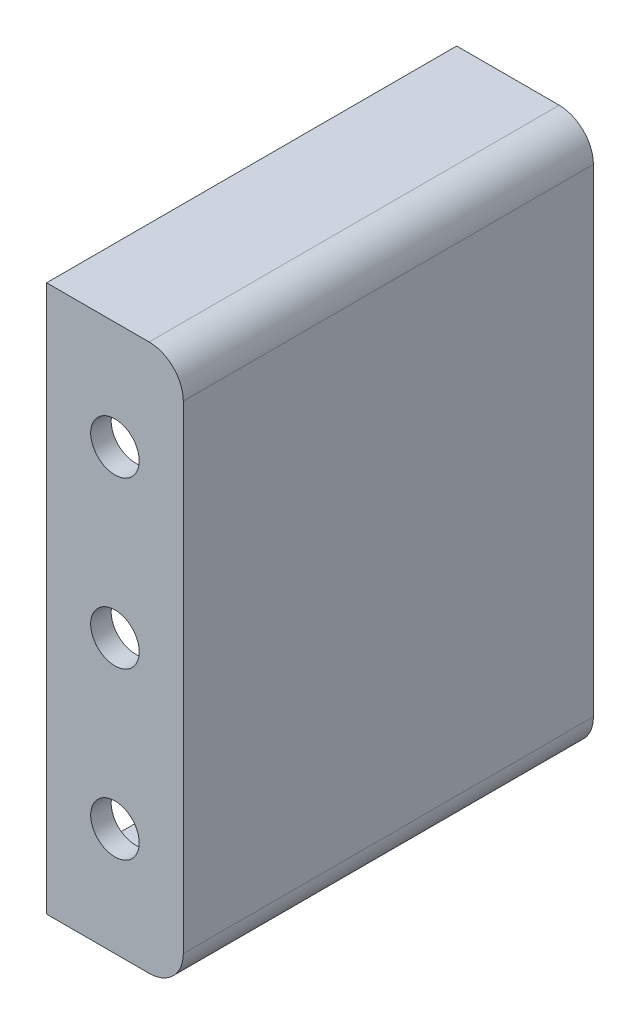
ISO-10303-21;
HEADER;
FILE_DESCRIPTION(('STEP AP214'),'2;1');
FILE_NAME('part.step','',(''),(''),'','','');
FILE_SCHEMA(('AUTOMOTIVE_DESIGN { 1 0 10303 214 1 1 1 1 }'));
ENDSEC;
DATA;
#1=APPLICATION_CONTEXT('core data for automotive mechanical design processes');
#2=APPLICATION_PROTOCOL_DEFINITION('international standard','automotive_design',2000,#1);
#3=PRODUCT_CONTEXT('',#1,'mechanical');
#4=PRODUCT('Part','Part','',(#3));
#5=PRODUCT_RELATED_PRODUCT_CATEGORY('part','',(#4));
#6=PRODUCT_DEFINITION_FORMATION('','',#4);
#7=PRODUCT_DEFINITION_CONTEXT('part definition',#1,'design');
#8=PRODUCT_DEFINITION('design','',#6,#7);
#9=PRODUCT_DEFINITION_SHAPE('','',#8);
#10=(LENGTH_UNIT() NAMED_UNIT(*) SI_UNIT(.MILLI.,.METRE.));
#11=(NAMED_UNIT(*) PLANE_ANGLE_UNIT() SI_UNIT($,.RADIAN.));
#12=(NAMED_UNIT(*) SI_UNIT($,.STERADIAN.) SOLID_ANGLE_UNIT());
#13=UNCERTAINTY_MEASURE_WITH_UNIT(LENGTH_MEASURE(1.E-05),#10,'distance_accuracy_value','');
#14=(GEOMETRIC_REPRESENTATION_CONTEXT(3) GLOBAL_UNCERTAINTY_ASSIGNED_CONTEXT((#13)) GLOBAL_UNIT_ASSIGNED_CONTEXT((#10,
#11,#12)) REPRESENTATION_CONTEXT('',''));
#15=CARTESIAN_POINT('',(0.,0.,0.));
#16=DIRECTION('',(0.,0.,1.));
#17=DIRECTION('',(1.,0.,0.));
#18=AXIS2_PLACEMENT_3D('',#15,#16,#17);
#19=CARTESIAN_POINT('',(0.,0.,60.));
#20=DIRECTION('',(0.,0.,1.));
#21=DIRECTION('',(1.,0.,0.));
#22=AXIS2_PLACEMENT_3D('',#19,#20,#21);
#23=PLANE('',#22);
#24=CARTESIAN_POINT('',(0.,-24.2,60.));
#25=DIRECTION('',(0.,0.,1.));
#26=DIRECTION('',(1.,0.,0.));
#27=AXIS2_PLACEMENT_3D('',#24,#25,#26);
#28=CIRCLE('',#27,3.55);
#29=CARTESIAN_POINT('',(3.55,-24.2,60.));
#30=VERTEX_POINT('',#29);
#31=EDGE_CURVE('E234',#30,#30,#28,.F.);
#32=ORIENTED_EDGE('',*,*,#31,.T.);
#33=EDGE_LOOP('',(#32));
#34=FACE_BOUND('',#33,.T.);
#35=DIRECTION('',(-1.,0.,0.));
#36=VECTOR('',#35,1.);
#37=CARTESIAN_POINT('',(0.,-40.,60.));
#38=LINE('',#37,#36);
#39=CARTESIAN_POINT('',(4.99999999999999,-40.,60.));
#40=VERTEX_POINT('',#39);
#41=CARTESIAN_POINT('',(-10.,-40.,60.));
#42=VERTEX_POINT('',#41);
#43=EDGE_CURVE('E180',#40,#42,#38,.T.);
#44=ORIENTED_EDGE('',*,*,#43,.F.);
#45=CARTESIAN_POINT('',(4.99999999999999,-35.,60.));
#46=DIRECTION('',(0.,0.,1.));
#47=DIRECTION('',(1.,0.,0.));
#48=AXIS2_PLACEMENT_3D('',#45,#46,#47);
#49=CIRCLE('',#48,5.);
#50=CARTESIAN_POINT('',(9.99999999999999,-35.,60.));
#51=VERTEX_POINT('',#50);
#52=EDGE_CURVE('E49',#40,#51,#49,.T.);
#53=ORIENTED_EDGE('',*,*,#52,.T.);
#54=DIRECTION('',(0.,1.,0.));
#55=VECTOR('',#54,1.);
#56=CARTESIAN_POINT('',(10.,0.,60.));
#57=LINE('',#56,#55);
#58=CARTESIAN_POINT('',(10.,35.,60.));
#59=VERTEX_POINT('',#58);
#60=EDGE_CURVE('E169',#51,#59,#57,.T.);
#61=ORIENTED_EDGE('',*,*,#60,.T.);
#62=CARTESIAN_POINT('',(5.,35.,60.));
#63=DIRECTION('',(0.,0.,1.));
#64=DIRECTION('',(1.,0.,0.));
#65=AXIS2_PLACEMENT_3D('',#62,#63,#64);
#66=CIRCLE('',#65,5.);
#67=CARTESIAN_POINT('',(5.,40.,60.));
#68=VERTEX_POINT('',#67);
#69=EDGE_CURVE('E59',#59,#68,#66,.T.);
#70=ORIENTED_EDGE('',*,*,#69,.T.);
#71=DIRECTION('',(-1.,0.,0.));
#72=VECTOR('',#71,1.);
#73=CARTESIAN_POINT('',(0.,40.,60.));
#74=LINE('',#73,#72);
#75=CARTESIAN_POINT('',(-10.,40.,60.));
#76=VERTEX_POINT('',#75);
#77=EDGE_CURVE('E171',#68,#76,#74,.T.);
#78=ORIENTED_EDGE('',*,*,#77,.T.);
#79=DIRECTION('',(0.,1.,0.));
#80=VECTOR('',#79,1.);
#81=CARTESIAN_POINT('',(-10.,0.,60.));
#82=LINE('',#81,#80);
#83=EDGE_CURVE('E172',#42,#76,#82,.T.);
#84=ORIENTED_EDGE('',*,*,#83,.F.);
#85=EDGE_LOOP('',(#44,#53,#61,#70,#78,#84));
#86=FACE_BOUND('',#85,.T.);
#87=CARTESIAN_POINT('',(0.,0.,60.));
#88=DIRECTION('',(0.,0.,1.));
#89=DIRECTION('',(1.,0.,0.));
#90=AXIS2_PLACEMENT_3D('',#87,#88,#89);
#91=CIRCLE('',#90,3.55);
#92=CARTESIAN_POINT('',(3.55,0.,60.));
#93=VERTEX_POINT('',#92);
#94=EDGE_CURVE('E237',#93,#93,#91,.T.);
#95=ORIENTED_EDGE('',*,*,#94,.F.);
#96=EDGE_LOOP('',(#95));
#97=FACE_BOUND('',#96,.T.);
#98=CARTESIAN_POINT('',(0.,24.2,60.));
#99=DIRECTION('',(0.,0.,1.));
#100=DIRECTION('',(1.,0.,0.));
#101=AXIS2_PLACEMENT_3D('',#98,#99,#100);
#102=CIRCLE('',#101,3.55);
#103=CARTESIAN_POINT('',(3.55,24.2,60.));
#104=VERTEX_POINT('',#103);
#105=EDGE_CURVE('E196',#104,#104,#102,.T.);
#106=ORIENTED_EDGE('',*,*,#105,.F.);
#107=EDGE_LOOP('',(#106));
#108=FACE_BOUND('',#107,.T.);
#109=ADVANCED_FACE('F41',(#34,#86,#97,#108),#23,.T.);
#110=CARTESIAN_POINT('',(0.,0.,57.));
#111=DIRECTION('',(0.,0.,1.));
#112=DIRECTION('',(1.,0.,0.));
#113=AXIS2_PLACEMENT_3D('',#110,#111,#112);
#114=PLANE('',#113);
#115=CARTESIAN_POINT('',(0.,0.,57.));
#116=DIRECTION('',(0.,0.,1.));
#117=DIRECTION('',(1.,0.,0.));
#118=AXIS2_PLACEMENT_3D('',#115,#116,#117);
#119=CIRCLE('',#118,3.55);
#120=CARTESIAN_POINT('',(3.55,0.,57.));
#121=VERTEX_POINT('',#120);
#122=EDGE_CURVE('E200',#121,#121,#119,.T.);
#123=ORIENTED_EDGE('',*,*,#122,.T.);
#124=EDGE_LOOP('',(#123));
#125=FACE_BOUND('',#124,.T.);
#126=CARTESIAN_POINT('',(0.,-24.2,57.));
#127=DIRECTION('',(0.,0.,1.));
#128=DIRECTION('',(1.,0.,0.));
#129=AXIS2_PLACEMENT_3D('',#126,#127,#128);
#130=CIRCLE('',#129,3.55);
#131=CARTESIAN_POINT('',(3.55,-24.2,57.));
#132=VERTEX_POINT('',#131);
#133=EDGE_CURVE('E195',#132,#132,#130,.F.);
#134=ORIENTED_EDGE('',*,*,#133,.F.);
#135=EDGE_LOOP('',(#134));
#136=FACE_BOUND('',#135,.T.);
#137=DIRECTION('',(-1.,0.,0.));
#138=VECTOR('',#137,1.);
#139=CARTESIAN_POINT('',(0.,37.,57.));
#140=LINE('',#139,#138);
#141=CARTESIAN_POINT('',(2.,37.,57.));
#142=VERTEX_POINT('',#141);
#143=CARTESIAN_POINT('',(-10.,37.,57.));
#144=VERTEX_POINT('',#143);
#145=EDGE_CURVE('E153',#142,#144,#140,.T.);
#146=ORIENTED_EDGE('',*,*,#145,.F.);
#147=CARTESIAN_POINT('',(2.,32.,57.));
#148=DIRECTION('',(0.,0.,1.));
#149=DIRECTION('',(1.,0.,0.));
#150=AXIS2_PLACEMENT_3D('',#147,#148,#149);
#151=CIRCLE('',#150,5.);
#152=CARTESIAN_POINT('',(7.,32.,57.));
#153=VERTEX_POINT('',#152);
#154=EDGE_CURVE('E218',#142,#153,#151,.F.);
#155=ORIENTED_EDGE('',*,*,#154,.T.);
#156=DIRECTION('',(0.,1.,0.));
#157=VECTOR('',#156,1.);
#158=CARTESIAN_POINT('',(7.,0.,57.));
#159=LINE('',#158,#157);
#160=CARTESIAN_POINT('',(6.99999999999999,-30.,57.));
#161=VERTEX_POINT('',#160);
#162=EDGE_CURVE('E162',#161,#153,#159,.T.);
#163=ORIENTED_EDGE('',*,*,#162,.F.);
#164=CARTESIAN_POINT('',(1.99999999999999,-30.,57.));
#165=DIRECTION('',(0.,0.,1.));
#166=DIRECTION('',(1.,0.,0.));
#167=AXIS2_PLACEMENT_3D('',#164,#165,#166);
#168=CIRCLE('',#167,5.);
#169=CARTESIAN_POINT('',(1.99999999999999,-35.,57.));
#170=VERTEX_POINT('',#169);
#171=EDGE_CURVE('E215',#161,#170,#168,.F.);
#172=ORIENTED_EDGE('',*,*,#171,.T.);
#173=DIRECTION('',(-1.,0.,0.));
#174=VECTOR('',#173,1.);
#175=CARTESIAN_POINT('',(0.,-35.,57.));
#176=LINE('',#175,#174);
#177=CARTESIAN_POINT('',(-10.,-35.,57.));
#178=VERTEX_POINT('',#177);
#179=EDGE_CURVE('E168',#170,#178,#176,.T.);
#180=ORIENTED_EDGE('',*,*,#179,.T.);
#181=DIRECTION('',(0.,1.,0.));
#182=VECTOR('',#181,1.);
#183=CARTESIAN_POINT('',(-10.,0.,57.));
#184=LINE('',#183,#182);
#185=EDGE_CURVE('E170',#178,#144,#184,.T.);
#186=ORIENTED_EDGE('',*,*,#185,.T.);
#187=EDGE_LOOP('',(#146,#155,#163,#172,#180,#186));
#188=FACE_BOUND('',#187,.T.);
#189=CARTESIAN_POINT('',(0.,24.2,57.));
#190=DIRECTION('',(0.,0.,1.));
#191=DIRECTION('',(1.,0.,0.));
#192=AXIS2_PLACEMENT_3D('',#189,#190,#191);
#193=CIRCLE('',#192,3.55);
#194=CARTESIAN_POINT('',(3.55,24.2,57.));
#195=VERTEX_POINT('',#194);
#196=EDGE_CURVE('E202',#195,#195,#193,.T.);
#197=ORIENTED_EDGE('',*,*,#196,.T.);
#198=EDGE_LOOP('',(#197));
#199=FACE_BOUND('',#198,.T.);
#200=ADVANCED_FACE('F285',(#125,#136,#188,#199),#114,.F.);
#201=CARTESIAN_POINT('',(-10.,0.,60.));
#202=DIRECTION('',(-1.,0.,0.));
#203=DIRECTION('',(0.,-1.,0.));
#204=AXIS2_PLACEMENT_3D('',#201,#202,#203);
#205=PLANE('',#204);
#206=DIRECTION('',(0.,1.,0.));
#207=VECTOR('',#206,1.);
#208=CARTESIAN_POINT('',(-10.,0.,0.));
#209=LINE('',#208,#207);
#210=CARTESIAN_POINT('',(-10.,-40.,0.));
#211=VERTEX_POINT('',#210);
#212=CARTESIAN_POINT('',(-10.,40.,0.));
#213=VERTEX_POINT('',#212);
#214=EDGE_CURVE('E183',#211,#213,#209,.T.);
#215=ORIENTED_EDGE('',*,*,#214,.F.);
#216=DIRECTION('',(0.,0.,-1.));
#217=VECTOR('',#216,1.);
#218=CARTESIAN_POINT('',(-10.,-40.,60.));
#219=LINE('',#218,#217);
#220=EDGE_CURVE('E177',#42,#211,#219,.T.);
#221=ORIENTED_EDGE('',*,*,#220,.F.);
#222=ORIENTED_EDGE('',*,*,#83,.T.);
#223=DIRECTION('',(0.,0.,-1.));
#224=VECTOR('',#223,1.);
#225=CARTESIAN_POINT('',(-10.,40.,60.));
#226=LINE('',#225,#224);
#227=EDGE_CURVE('E188',#76,#213,#226,.T.);
#228=ORIENTED_EDGE('',*,*,#227,.T.);
#229=EDGE_LOOP('',(#215,#221,#222,#228));
#230=FACE_BOUND('',#229,.T.);
#231=DIRECTION('',(0.,0.,-1.));
#232=VECTOR('',#231,1.);
#233=CARTESIAN_POINT('',(-10.,-35.,60.));
#234=LINE('',#233,#232);
#235=CARTESIAN_POINT('',(-10.,-35.,3.));
#236=VERTEX_POINT('',#235);
#237=EDGE_CURVE('E157',#178,#236,#234,.T.);
#238=ORIENTED_EDGE('',*,*,#237,.T.);
#239=DIRECTION('',(0.,1.,0.));
#240=VECTOR('',#239,1.);
#241=CARTESIAN_POINT('',(-10.,0.,3.));
#242=LINE('',#241,#240);
#243=CARTESIAN_POINT('',(-10.,37.,3.));
#244=VERTEX_POINT('',#243);
#245=EDGE_CURVE('E138',#236,#244,#242,.T.);
#246=ORIENTED_EDGE('',*,*,#245,.T.);
#247=DIRECTION('',(0.,0.,-1.));
#248=VECTOR('',#247,1.);
#249=CARTESIAN_POINT('',(-10.,37.,60.));
#250=LINE('',#249,#248);
#251=EDGE_CURVE('E147',#144,#244,#250,.T.);
#252=ORIENTED_EDGE('',*,*,#251,.F.);
#253=ORIENTED_EDGE('',*,*,#185,.F.);
#254=EDGE_LOOP('',(#238,#246,#252,#253));
#255=FACE_BOUND('',#254,.T.);
#256=ADVANCED_FACE('F159',(#230,#255),#205,.T.);
#257=CARTESIAN_POINT('',(10.,0.,60.));
#258=DIRECTION('',(-1.,0.,0.));
#259=DIRECTION('',(0.,-1.,0.));
#260=AXIS2_PLACEMENT_3D('',#257,#258,#259);
#261=PLANE('',#260);
#262=ORIENTED_EDGE('',*,*,#60,.F.);
#263=DIRECTION('',(0.,0.,-1.));
#264=VECTOR('',#263,1.);
#265=CARTESIAN_POINT('',(9.99999999999999,-35.,0.));
#266=LINE('',#265,#264);
#267=CARTESIAN_POINT('',(9.99999999999999,-35.,0.));
#268=VERTEX_POINT('',#267);
#269=EDGE_CURVE('E224',#51,#268,#266,.T.);
#270=ORIENTED_EDGE('',*,*,#269,.T.);
#271=DIRECTION('',(0.,1.,0.));
#272=VECTOR('',#271,1.);
#273=CARTESIAN_POINT('',(10.,0.,0.));
#274=LINE('',#273,#272);
#275=CARTESIAN_POINT('',(10.,35.,0.));
#276=VERTEX_POINT('',#275);
#277=EDGE_CURVE('E154',#268,#276,#274,.T.);
#278=ORIENTED_EDGE('',*,*,#277,.T.);
#279=DIRECTION('',(0.,0.,-1.));
#280=VECTOR('',#279,1.);
#281=CARTESIAN_POINT('',(10.,35.,60.));
#282=LINE('',#281,#280);
#283=EDGE_CURVE('E222',#276,#59,#282,.F.);
#284=ORIENTED_EDGE('',*,*,#283,.T.);
#285=EDGE_LOOP('',(#262,#270,#278,#284));
#286=FACE_BOUND('',#285,.T.);
#287=ADVANCED_FACE('F327',(#286),#261,.F.);
#288=CARTESIAN_POINT('',(0.,40.,60.));
#289=DIRECTION('',(0.,-1.,0.));
#290=DIRECTION('',(0.,0.,-1.));
#291=AXIS2_PLACEMENT_3D('',#288,#289,#290);
#292=PLANE('',#291);
#293=ORIENTED_EDGE('',*,*,#77,.F.);
#294=DIRECTION('',(0.,0.,-1.));
#295=VECTOR('',#294,1.);
#296=CARTESIAN_POINT('',(5.,40.,60.));
#297=LINE('',#296,#295);
#298=CARTESIAN_POINT('',(5.,40.,0.));
#299=VERTEX_POINT('',#298);
#300=EDGE_CURVE('E11',#68,#299,#297,.T.);
#301=ORIENTED_EDGE('',*,*,#300,.T.);
#302=DIRECTION('',(-1.,0.,0.));
#303=VECTOR('',#302,1.);
#304=CARTESIAN_POINT('',(0.,40.,0.));
#305=LINE('',#304,#303);
#306=EDGE_CURVE('E185',#299,#213,#305,.T.);
#307=ORIENTED_EDGE('',*,*,#306,.T.);
#308=ORIENTED_EDGE('',*,*,#227,.F.);
#309=EDGE_LOOP('',(#293,#301,#307,#308));
#310=FACE_BOUND('',#309,.T.);
#311=ADVANCED_FACE('F328',(#310),#292,.F.);
#312=CARTESIAN_POINT('',(0.,-40.,60.));
#313=DIRECTION('',(0.,-1.,0.));
#314=DIRECTION('',(0.,0.,-1.));
#315=AXIS2_PLACEMENT_3D('',#312,#313,#314);
#316=PLANE('',#315);
#317=DIRECTION('',(-1.,0.,0.));
#318=VECTOR('',#317,1.);
#319=CARTESIAN_POINT('',(0.,-40.,0.));
#320=LINE('',#319,#318);
#321=CARTESIAN_POINT('',(4.99999999999999,-40.,0.));
#322=VERTEX_POINT('',#321);
#323=EDGE_CURVE('E175',#322,#211,#320,.T.);
#324=ORIENTED_EDGE('',*,*,#323,.F.);
#325=DIRECTION('',(0.,0.,-1.));
#326=VECTOR('',#325,1.);
#327=CARTESIAN_POINT('',(4.99999999999999,-40.,60.));
#328=LINE('',#327,#326);
#329=EDGE_CURVE('E68',#322,#40,#328,.F.);
#330=ORIENTED_EDGE('',*,*,#329,.T.);
#331=ORIENTED_EDGE('',*,*,#43,.T.);
#332=ORIENTED_EDGE('',*,*,#220,.T.);
#333=EDGE_LOOP('',(#324,#330,#331,#332));
#334=FACE_BOUND('',#333,.T.);
#335=ADVANCED_FACE('F324',(#334),#316,.T.);
#336=CARTESIAN_POINT('',(0.,0.,0.));
#337=DIRECTION('',(0.,0.,1.));
#338=DIRECTION('',(1.,0.,0.));
#339=AXIS2_PLACEMENT_3D('',#336,#337,#338);
#340=PLANE('',#339);
#341=CARTESIAN_POINT('',(0.,-22.5,0.));
#342=DIRECTION('',(0.,0.,-1.));
#343=DIRECTION('',(-1.,0.,0.));
#344=AXIS2_PLACEMENT_3D('',#341,#342,#343);
#345=CIRCLE('',#344,4.9);
#346=CARTESIAN_POINT('',(-4.9,-22.5,0.));
#347=VERTEX_POINT('',#346);
#348=EDGE_CURVE('E254',#347,#347,#345,.T.);
#349=ORIENTED_EDGE('',*,*,#348,.F.);
#350=EDGE_LOOP('',(#349));
#351=FACE_BOUND('',#350,.T.);
#352=CARTESIAN_POINT('',(0.,-7.5,0.));
#353=DIRECTION('',(0.,0.,-1.));
#354=DIRECTION('',(-1.,0.,0.));
#355=AXIS2_PLACEMENT_3D('',#352,#353,#354);
#356=CIRCLE('',#355,4.9);
#357=CARTESIAN_POINT('',(-4.9,-7.5,0.));
#358=VERTEX_POINT('',#357);
#359=EDGE_CURVE('E256',#358,#358,#356,.T.);
#360=ORIENTED_EDGE('',*,*,#359,.F.);
#361=EDGE_LOOP('',(#360));
#362=FACE_BOUND('',#361,.T.);
#363=CARTESIAN_POINT('',(0.,7.5,0.));
#364=DIRECTION('',(0.,0.,-1.));
#365=DIRECTION('',(-1.,0.,0.));
#366=AXIS2_PLACEMENT_3D('',#363,#364,#365);
#367=CIRCLE('',#366,4.9);
#368=CARTESIAN_POINT('',(-4.9,7.5,0.));
#369=VERTEX_POINT('',#368);
#370=EDGE_CURVE('E267',#369,#369,#367,.T.);
#371=ORIENTED_EDGE('',*,*,#370,.F.);
#372=EDGE_LOOP('',(#371));
#373=FACE_BOUND('',#372,.T.);
#374=CARTESIAN_POINT('',(0.,22.5,0.));
#375=DIRECTION('',(0.,0.,-1.));
#376=DIRECTION('',(-1.,0.,0.));
#377=AXIS2_PLACEMENT_3D('',#374,#375,#376);
#378=CIRCLE('',#377,4.9);
#379=CARTESIAN_POINT('',(-4.9,22.5,0.));
#380=VERTEX_POINT('',#379);
#381=EDGE_CURVE('E201',#380,#380,#378,.T.);
#382=ORIENTED_EDGE('',*,*,#381,.F.);
#383=EDGE_LOOP('',(#382));
#384=FACE_BOUND('',#383,.T.);
#385=ORIENTED_EDGE('',*,*,#277,.F.);
#386=CARTESIAN_POINT('',(4.99999999999999,-35.,0.));
#387=DIRECTION('',(0.,0.,1.));
#388=DIRECTION('',(1.,0.,0.));
#389=AXIS2_PLACEMENT_3D('',#386,#387,#388);
#390=CIRCLE('',#389,5.);
#391=EDGE_CURVE('E226',#268,#322,#390,.F.);
#392=ORIENTED_EDGE('',*,*,#391,.T.);
#393=ORIENTED_EDGE('',*,*,#323,.T.);
#394=ORIENTED_EDGE('',*,*,#214,.T.);
#395=ORIENTED_EDGE('',*,*,#306,.F.);
#396=CARTESIAN_POINT('',(5.,35.,0.));
#397=DIRECTION('',(0.,0.,1.));
#398=DIRECTION('',(1.,0.,0.));
#399=AXIS2_PLACEMENT_3D('',#396,#397,#398);
#400=CIRCLE('',#399,5.);
#401=EDGE_CURVE('E228',#299,#276,#400,.F.);
#402=ORIENTED_EDGE('',*,*,#401,.T.);
#403=EDGE_LOOP('',(#385,#392,#393,#394,#395,#402));
#404=FACE_BOUND('',#403,.T.);
#405=ADVANCED_FACE('F316',(#351,#362,#373,#384,#404),#340,.F.);
#406=CARTESIAN_POINT('',(7.,0.,60.));
#407=DIRECTION('',(-1.,0.,0.));
#408=DIRECTION('',(0.,-1.,0.));
#409=AXIS2_PLACEMENT_3D('',#406,#407,#408);
#410=PLANE('',#409);
#411=ORIENTED_EDGE('',*,*,#162,.T.);
#412=DIRECTION('',(0.,0.,-1.));
#413=VECTOR('',#412,1.);
#414=CARTESIAN_POINT('',(7.,32.,3.));
#415=LINE('',#414,#413);
#416=CARTESIAN_POINT('',(7.,32.,3.));
#417=VERTEX_POINT('',#416);
#418=EDGE_CURVE('E207',#153,#417,#415,.T.);
#419=ORIENTED_EDGE('',*,*,#418,.T.);
#420=DIRECTION('',(0.,1.,0.));
#421=VECTOR('',#420,1.);
#422=CARTESIAN_POINT('',(7.,0.,3.));
#423=LINE('',#422,#421);
#424=CARTESIAN_POINT('',(6.99999999999999,-30.,3.));
#425=VERTEX_POINT('',#424);
#426=EDGE_CURVE('E143',#425,#417,#423,.T.);
#427=ORIENTED_EDGE('',*,*,#426,.F.);
#428=DIRECTION('',(0.,0.,-1.));
#429=VECTOR('',#428,1.);
#430=CARTESIAN_POINT('',(6.99999999999999,-30.,60.));
#431=LINE('',#430,#429);
#432=EDGE_CURVE('E192',#425,#161,#431,.F.);
#433=ORIENTED_EDGE('',*,*,#432,.T.);
#434=EDGE_LOOP('',(#411,#419,#427,#433));
#435=FACE_BOUND('',#434,.T.);
#436=ADVANCED_FACE('F291',(#435),#410,.T.);
#437=CARTESIAN_POINT('',(0.,37.,60.));
#438=DIRECTION('',(0.,-1.,0.));
#439=DIRECTION('',(0.,0.,-1.));
#440=AXIS2_PLACEMENT_3D('',#437,#438,#439);
#441=PLANE('',#440);
#442=CARTESIAN_POINT('',(-2.50000000000001,37.,30.));
#443=DIRECTION('',(0.,-1.,0.));
#444=DIRECTION('',(0.,0.,-1.));
#445=AXIS2_PLACEMENT_3D('',#442,#443,#444);
#446=CIRCLE('',#445,4.25);
#447=CARTESIAN_POINT('',(-2.50000000000001,37.,25.75));
#448=VERTEX_POINT('',#447);
#449=EDGE_CURVE('E235',#448,#448,#446,.T.);
#450=ORIENTED_EDGE('',*,*,#449,.F.);
#451=EDGE_LOOP('',(#450));
#452=FACE_BOUND('',#451,.T.);
#453=DIRECTION('',(-1.,0.,0.));
#454=VECTOR('',#453,1.);
#455=CARTESIAN_POINT('',(0.,37.,3.));
#456=LINE('',#455,#454);
#457=CARTESIAN_POINT('',(2.,37.,3.));
#458=VERTEX_POINT('',#457);
#459=EDGE_CURVE('E132',#458,#244,#456,.T.);
#460=ORIENTED_EDGE('',*,*,#459,.F.);
#461=DIRECTION('',(0.,0.,-1.));
#462=VECTOR('',#461,1.);
#463=CARTESIAN_POINT('',(2.,37.,57.));
#464=LINE('',#463,#462);
#465=EDGE_CURVE('E214',#458,#142,#464,.F.);
#466=ORIENTED_EDGE('',*,*,#465,.T.);
#467=ORIENTED_EDGE('',*,*,#145,.T.);
#468=ORIENTED_EDGE('',*,*,#251,.T.);
#469=EDGE_LOOP('',(#460,#466,#467,#468));
#470=FACE_BOUND('',#469,.T.);
#471=ADVANCED_FACE('F150',(#452,#470),#441,.T.);
#472=CARTESIAN_POINT('',(0.,-35.,60.));
#473=DIRECTION('',(0.,-1.,0.));
#474=DIRECTION('',(0.,0.,-1.));
#475=AXIS2_PLACEMENT_3D('',#472,#473,#474);
#476=PLANE('',#475);
#477=CARTESIAN_POINT('',(-2.50000000000001,-35.,30.));
#478=DIRECTION('',(0.,-1.,0.));
#479=DIRECTION('',(0.,0.,-1.));
#480=AXIS2_PLACEMENT_3D('',#477,#478,#479);
#481=CIRCLE('',#480,4.25);
#482=CARTESIAN_POINT('',(-2.50000000000001,-35.,25.75));
#483=VERTEX_POINT('',#482);
#484=EDGE_CURVE('E44',#483,#483,#481,.F.);
#485=ORIENTED_EDGE('',*,*,#484,.F.);
#486=EDGE_LOOP('',(#485));
#487=FACE_BOUND('',#486,.T.);
#488=ORIENTED_EDGE('',*,*,#179,.F.);
#489=DIRECTION('',(0.,0.,-1.));
#490=VECTOR('',#489,1.);
#491=CARTESIAN_POINT('',(1.99999999999999,-35.,60.));
#492=LINE('',#491,#490);
#493=CARTESIAN_POINT('',(1.99999999999999,-35.,3.));
#494=VERTEX_POINT('',#493);
#495=EDGE_CURVE('E216',#170,#494,#492,.T.);
#496=ORIENTED_EDGE('',*,*,#495,.T.);
#497=DIRECTION('',(-1.,0.,0.));
#498=VECTOR('',#497,1.);
#499=CARTESIAN_POINT('',(0.,-35.,3.));
#500=LINE('',#499,#498);
#501=EDGE_CURVE('E158',#494,#236,#500,.T.);
#502=ORIENTED_EDGE('',*,*,#501,.T.);
#503=ORIENTED_EDGE('',*,*,#237,.F.);
#504=EDGE_LOOP('',(#488,#496,#502,#503));
#505=FACE_BOUND('',#504,.T.);
#506=ADVANCED_FACE('F289',(#487,#505),#476,.F.);
#507=CARTESIAN_POINT('',(0.,0.,3.));
#508=DIRECTION('',(0.,0.,1.));
#509=DIRECTION('',(1.,0.,0.));
#510=AXIS2_PLACEMENT_3D('',#507,#508,#509);
#511=PLANE('',#510);
#512=CARTESIAN_POINT('',(0.,-22.5,3.));
#513=DIRECTION('',(0.,0.,1.));
#514=DIRECTION('',(1.,0.,0.));
#515=AXIS2_PLACEMENT_3D('',#512,#513,#514);
#516=CIRCLE('',#515,4.9);
#517=CARTESIAN_POINT('',(4.9,-22.5,3.));
#518=VERTEX_POINT('',#517);
#519=EDGE_CURVE('E258',#518,#518,#516,.F.);
#520=ORIENTED_EDGE('',*,*,#519,.T.);
#521=EDGE_LOOP('',(#520));
#522=FACE_BOUND('',#521,.T.);
#523=CARTESIAN_POINT('',(0.,-7.5,3.));
#524=DIRECTION('',(0.,0.,1.));
#525=DIRECTION('',(1.,0.,0.));
#526=AXIS2_PLACEMENT_3D('',#523,#524,#525);
#527=CIRCLE('',#526,4.9);
#528=CARTESIAN_POINT('',(4.9,-7.5,3.));
#529=VERTEX_POINT('',#528);
#530=EDGE_CURVE('E259',#529,#529,#527,.F.);
#531=ORIENTED_EDGE('',*,*,#530,.T.);
#532=EDGE_LOOP('',(#531));
#533=FACE_BOUND('',#532,.T.);
#534=CARTESIAN_POINT('',(0.,7.5,3.));
#535=DIRECTION('',(0.,0.,1.));
#536=DIRECTION('',(1.,0.,0.));
#537=AXIS2_PLACEMENT_3D('',#534,#535,#536);
#538=CIRCLE('',#537,4.9);
#539=CARTESIAN_POINT('',(4.9,7.5,3.));
#540=VERTEX_POINT('',#539);
#541=EDGE_CURVE('E261',#540,#540,#538,.F.);
#542=ORIENTED_EDGE('',*,*,#541,.T.);
#543=EDGE_LOOP('',(#542));
#544=FACE_BOUND('',#543,.T.);
#545=CARTESIAN_POINT('',(0.,22.5,3.));
#546=DIRECTION('',(0.,0.,1.));
#547=DIRECTION('',(1.,0.,0.));
#548=AXIS2_PLACEMENT_3D('',#545,#546,#547);
#549=CIRCLE('',#548,4.9);
#550=CARTESIAN_POINT('',(4.9,22.5,3.));
#551=VERTEX_POINT('',#550);
#552=EDGE_CURVE('E266',#551,#551,#549,.F.);
#553=ORIENTED_EDGE('',*,*,#552,.T.);
#554=EDGE_LOOP('',(#553));
#555=FACE_BOUND('',#554,.T.);
#556=ORIENTED_EDGE('',*,*,#426,.T.);
#557=CARTESIAN_POINT('',(2.,32.,3.));
#558=DIRECTION('',(0.,0.,1.));
#559=DIRECTION('',(1.,0.,0.));
#560=AXIS2_PLACEMENT_3D('',#557,#558,#559);
#561=CIRCLE('',#560,5.);
#562=EDGE_CURVE('E145',#417,#458,#561,.T.);
#563=ORIENTED_EDGE('',*,*,#562,.T.);
#564=ORIENTED_EDGE('',*,*,#459,.T.);
#565=ORIENTED_EDGE('',*,*,#245,.F.);
#566=ORIENTED_EDGE('',*,*,#501,.F.);
#567=CARTESIAN_POINT('',(1.99999999999999,-30.,3.));
#568=DIRECTION('',(0.,0.,1.));
#569=DIRECTION('',(1.,0.,0.));
#570=AXIS2_PLACEMENT_3D('',#567,#568,#569);
#571=CIRCLE('',#570,5.);
#572=EDGE_CURVE('E209',#494,#425,#571,.T.);
#573=ORIENTED_EDGE('',*,*,#572,.T.);
#574=EDGE_LOOP('',(#556,#563,#564,#565,#566,#573));
#575=FACE_BOUND('',#574,.T.);
#576=ADVANCED_FACE('F140',(#522,#533,#544,#555,#575),#511,.T.);
#577=CARTESIAN_POINT('',(0.,22.5,16.8592929112563));
#578=DIRECTION('',(0.,0.,-1.));
#579=DIRECTION('',(-1.,0.,0.));
#580=AXIS2_PLACEMENT_3D('',#577,#578,#579);
#581=CYLINDRICAL_SURFACE('',#580,4.9);
#582=ORIENTED_EDGE('',*,*,#381,.T.);
#583=EDGE_LOOP('',(#582));
#584=FACE_BOUND('',#583,.T.);
#585=ORIENTED_EDGE('',*,*,#552,.F.);
#586=EDGE_LOOP('',(#585));
#587=FACE_BOUND('',#586,.T.);
#588=ADVANCED_FACE('F387',(#584,#587),#581,.F.);
#589=CARTESIAN_POINT('',(0.,7.5,16.8592929112563));
#590=DIRECTION('',(0.,0.,-1.));
#591=DIRECTION('',(-1.,0.,0.));
#592=AXIS2_PLACEMENT_3D('',#589,#590,#591);
#593=CYLINDRICAL_SURFACE('',#592,4.9);
#594=ORIENTED_EDGE('',*,*,#370,.T.);
#595=EDGE_LOOP('',(#594));
#596=FACE_BOUND('',#595,.T.);
#597=ORIENTED_EDGE('',*,*,#541,.F.);
#598=EDGE_LOOP('',(#597));
#599=FACE_BOUND('',#598,.T.);
#600=ADVANCED_FACE('F381',(#596,#599),#593,.F.);
#601=CARTESIAN_POINT('',(0.,-7.5,16.8592929112563));
#602=DIRECTION('',(0.,0.,-1.));
#603=DIRECTION('',(-1.,0.,0.));
#604=AXIS2_PLACEMENT_3D('',#601,#602,#603);
#605=CYLINDRICAL_SURFACE('',#604,4.9);
#606=ORIENTED_EDGE('',*,*,#359,.T.);
#607=EDGE_LOOP('',(#606));
#608=FACE_BOUND('',#607,.T.);
#609=ORIENTED_EDGE('',*,*,#530,.F.);
#610=EDGE_LOOP('',(#609));
#611=FACE_BOUND('',#610,.T.);
#612=ADVANCED_FACE('F379',(#608,#611),#605,.F.);
#613=CARTESIAN_POINT('',(0.,-22.5,16.8592929112563));
#614=DIRECTION('',(0.,0.,-1.));
#615=DIRECTION('',(-1.,0.,0.));
#616=AXIS2_PLACEMENT_3D('',#613,#614,#615);
#617=CYLINDRICAL_SURFACE('',#616,4.9);
#618=ORIENTED_EDGE('',*,*,#348,.T.);
#619=EDGE_LOOP('',(#618));
#620=FACE_BOUND('',#619,.T.);
#621=ORIENTED_EDGE('',*,*,#519,.F.);
#622=EDGE_LOOP('',(#621));
#623=FACE_BOUND('',#622,.T.);
#624=ADVANCED_FACE('F376',(#620,#623),#617,.F.);
#625=CARTESIAN_POINT('',(0.,-24.2,50.));
#626=DIRECTION('',(0.,0.,1.));
#627=DIRECTION('',(1.,0.,0.));
#628=AXIS2_PLACEMENT_3D('',#625,#626,#627);
#629=CYLINDRICAL_SURFACE('',#628,3.55);
#630=ORIENTED_EDGE('',*,*,#31,.F.);
#631=EDGE_LOOP('',(#630));
#632=FACE_BOUND('',#631,.T.);
#633=ORIENTED_EDGE('',*,*,#133,.T.);
#634=EDGE_LOOP('',(#633));
#635=FACE_BOUND('',#634,.T.);
#636=ADVANCED_FACE('F375',(#632,#635),#629,.F.);
#637=CARTESIAN_POINT('',(0.,0.,50.));
#638=DIRECTION('',(0.,0.,1.));
#639=DIRECTION('',(1.,0.,0.));
#640=AXIS2_PLACEMENT_3D('',#637,#638,#639);
#641=CYLINDRICAL_SURFACE('',#640,3.55);
#642=ORIENTED_EDGE('',*,*,#94,.T.);
#643=EDGE_LOOP('',(#642));
#644=FACE_BOUND('',#643,.T.);
#645=ORIENTED_EDGE('',*,*,#122,.F.);
#646=EDGE_LOOP('',(#645));
#647=FACE_BOUND('',#646,.T.);
#648=ADVANCED_FACE('F368',(#644,#647),#641,.F.);
#649=CARTESIAN_POINT('',(0.,24.2,50.));
#650=DIRECTION('',(0.,0.,1.));
#651=DIRECTION('',(1.,0.,0.));
#652=AXIS2_PLACEMENT_3D('',#649,#650,#651);
#653=CYLINDRICAL_SURFACE('',#652,3.55);
#654=ORIENTED_EDGE('',*,*,#105,.T.);
#655=EDGE_LOOP('',(#654));
#656=FACE_BOUND('',#655,.T.);
#657=ORIENTED_EDGE('',*,*,#196,.F.);
#658=EDGE_LOOP('',(#657));
#659=FACE_BOUND('',#658,.T.);
#660=ADVANCED_FACE('F304',(#656,#659),#653,.F.);
#661=CARTESIAN_POINT('',(2.,32.,60.));
#662=DIRECTION('',(0.,0.,1.));
#663=DIRECTION('',(1.,0.,0.));
#664=AXIS2_PLACEMENT_3D('',#661,#662,#663);
#665=CYLINDRICAL_SURFACE('',#664,5.);
#666=ORIENTED_EDGE('',*,*,#154,.F.);
#667=ORIENTED_EDGE('',*,*,#465,.F.);
#668=ORIENTED_EDGE('',*,*,#562,.F.);
#669=ORIENTED_EDGE('',*,*,#418,.F.);
#670=EDGE_LOOP('',(#666,#667,#668,#669));
#671=FACE_BOUND('',#670,.T.);
#672=ADVANCED_FACE('F296',(#671),#665,.F.);
#673=CARTESIAN_POINT('',(1.99999999999999,-30.,60.));
#674=DIRECTION('',(0.,0.,-1.));
#675=DIRECTION('',(-1.,0.,0.));
#676=AXIS2_PLACEMENT_3D('',#673,#674,#675);
#677=CYLINDRICAL_SURFACE('',#676,5.);
#678=ORIENTED_EDGE('',*,*,#171,.F.);
#679=ORIENTED_EDGE('',*,*,#432,.F.);
#680=ORIENTED_EDGE('',*,*,#572,.F.);
#681=ORIENTED_EDGE('',*,*,#495,.F.);
#682=EDGE_LOOP('',(#678,#679,#680,#681));
#683=FACE_BOUND('',#682,.T.);
#684=ADVANCED_FACE('F294',(#683),#677,.F.);
#685=CARTESIAN_POINT('',(4.99999999999999,-35.,60.));
#686=DIRECTION('',(0.,0.,1.));
#687=DIRECTION('',(1.,0.,0.));
#688=AXIS2_PLACEMENT_3D('',#685,#686,#687);
#689=CYLINDRICAL_SURFACE('',#688,5.);
#690=ORIENTED_EDGE('',*,*,#52,.F.);
#691=ORIENTED_EDGE('',*,*,#329,.F.);
#692=ORIENTED_EDGE('',*,*,#391,.F.);
#693=ORIENTED_EDGE('',*,*,#269,.F.);
#694=EDGE_LOOP('',(#690,#691,#692,#693));
#695=FACE_BOUND('',#694,.T.);
#696=ADVANCED_FACE('F300',(#695),#689,.T.);
#697=CARTESIAN_POINT('',(5.,35.,60.));
#698=DIRECTION('',(0.,0.,-1.));
#699=DIRECTION('',(-1.,0.,0.));
#700=AXIS2_PLACEMENT_3D('',#697,#698,#699);
#701=CYLINDRICAL_SURFACE('',#700,5.);
#702=ORIENTED_EDGE('',*,*,#69,.F.);
#703=ORIENTED_EDGE('',*,*,#283,.F.);
#704=ORIENTED_EDGE('',*,*,#401,.F.);
#705=ORIENTED_EDGE('',*,*,#300,.F.);
#706=EDGE_LOOP('',(#702,#703,#704,#705));
#707=FACE_BOUND('',#706,.T.);
#708=ADVANCED_FACE('F43',(#707),#701,.T.);
#709=CARTESIAN_POINT('',(-2.50000000000001,34.8,30.));
#710=DIRECTION('',(0.,1.,0.));
#711=DIRECTION('',(0.,0.,1.));
#712=AXIS2_PLACEMENT_3D('',#709,#710,#711);
#713=CYLINDRICAL_SURFACE('',#712,4.25);
#714=ORIENTED_EDGE('',*,*,#449,.T.);
#715=EDGE_LOOP('',(#714));
#716=FACE_BOUND('',#715,.T.);
#717=CARTESIAN_POINT('',(-2.50000000000001,38.,30.));
#718=DIRECTION('',(0.,1.,0.));
#719=DIRECTION('',(0.,0.,1.));
#720=AXIS2_PLACEMENT_3D('',#717,#718,#719);
#721=CIRCLE('',#720,4.25);
#722=CARTESIAN_POINT('',(-2.50000000000001,38.,34.25));
#723=VERTEX_POINT('',#722);
#724=EDGE_CURVE('E232',#723,#723,#721,.T.);
#725=ORIENTED_EDGE('',*,*,#724,.T.);
#726=EDGE_LOOP('',(#725));
#727=FACE_BOUND('',#726,.T.);
#728=ADVANCED_FACE('F355',(#716,#727),#713,.F.);
#729=CARTESIAN_POINT('',(-2.50000000000001,38.,30.));
#730=DIRECTION('',(0.,1.,0.));
#731=DIRECTION('',(0.,0.,1.));
#732=AXIS2_PLACEMENT_3D('',#729,#730,#731);
#733=PLANE('',#732);
#734=ORIENTED_EDGE('',*,*,#724,.F.);
#735=EDGE_LOOP('',(#734));
#736=FACE_BOUND('',#735,.T.);
#737=ADVANCED_FACE('F357',(#736),#733,.F.);
#738=CARTESIAN_POINT('',(-2.50000000000001,-34.8,30.));
#739=DIRECTION('',(0.,-1.,0.));
#740=DIRECTION('',(0.,0.,-1.));
#741=AXIS2_PLACEMENT_3D('',#738,#739,#740);
#742=CYLINDRICAL_SURFACE('',#741,4.25);
#743=CARTESIAN_POINT('',(-2.50000000000001,-38.,30.));
#744=DIRECTION('',(0.,1.,0.));
#745=DIRECTION('',(0.,0.,1.));
#746=AXIS2_PLACEMENT_3D('',#743,#744,#745);
#747=CIRCLE('',#746,4.25);
#748=CARTESIAN_POINT('',(-2.50000000000001,-38.,34.25));
#749=VERTEX_POINT('',#748);
#750=EDGE_CURVE('E246',#749,#749,#747,.T.);
#751=ORIENTED_EDGE('',*,*,#750,.F.);
#752=EDGE_LOOP('',(#751));
#753=FACE_BOUND('',#752,.T.);
#754=ORIENTED_EDGE('',*,*,#484,.T.);
#755=EDGE_LOOP('',(#754));
#756=FACE_BOUND('',#755,.T.);
#757=ADVANCED_FACE('F365',(#753,#756),#742,.F.);
#758=CARTESIAN_POINT('',(-2.50000000000001,-38.,30.));
#759=DIRECTION('',(0.,-1.,0.));
#760=DIRECTION('',(0.,0.,1.));
#761=AXIS2_PLACEMENT_3D('',#758,#759,#760);
#762=PLANE('',#761);
#763=ORIENTED_EDGE('',*,*,#750,.T.);
#764=EDGE_LOOP('',(#763));
#765=FACE_BOUND('',#764,.T.);
#766=ADVANCED_FACE('F408',(#765),#762,.F.);
#767=CLOSED_SHELL('',(#109,#200,#256,#287,#311,#335,#405,#436,#471,#506,#576,#588,#600,#612,
#624,#636,#648,#660,#672,#684,#696,#708,#728,#737,#757,#766));
#768=MANIFOLD_SOLID_BREP('B2',#767);
#769=ADVANCED_BREP_SHAPE_REPRESENTATION('',(#18,#768),#14);
#770=SHAPE_DEFINITION_REPRESENTATION(#9,#769);
ENDSEC;
END-ISO-10303-21;
